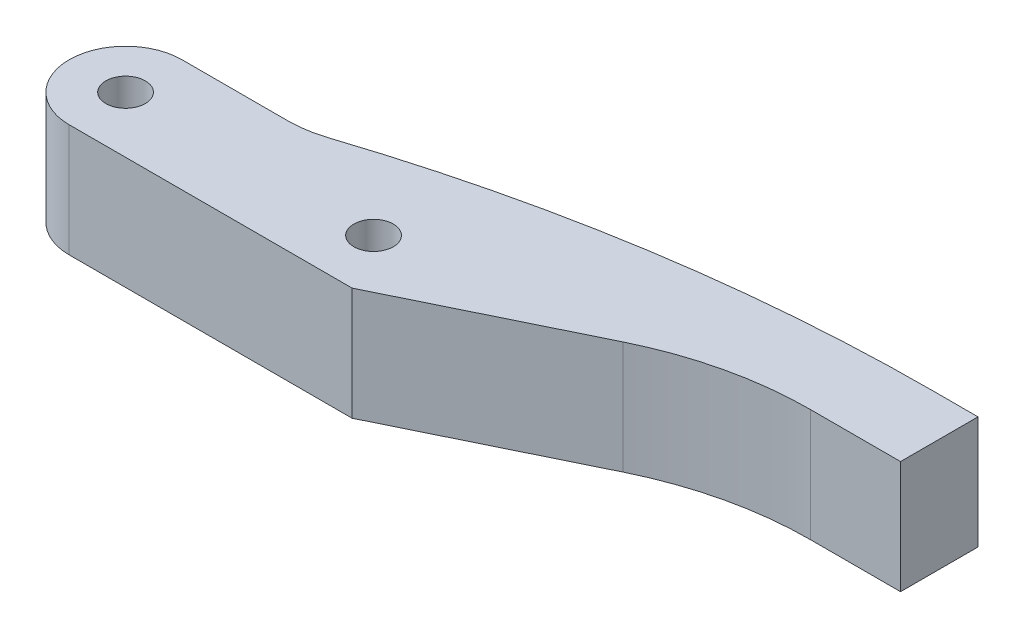
ISO-10303-21;
HEADER;
FILE_DESCRIPTION(('STEP AP214'),'2;1');
FILE_NAME('part.step','',(''),(''),'','','');
FILE_SCHEMA(('AUTOMOTIVE_DESIGN { 1 0 10303 214 1 1 1 1 }'));
ENDSEC;
DATA;
#1=APPLICATION_CONTEXT('core data for automotive mechanical design processes');
#2=APPLICATION_PROTOCOL_DEFINITION('international standard','automotive_design',2000,#1);
#3=PRODUCT_CONTEXT('',#1,'mechanical');
#4=PRODUCT('Part','Part','',(#3));
#5=PRODUCT_RELATED_PRODUCT_CATEGORY('part','',(#4));
#6=PRODUCT_DEFINITION_FORMATION('','',#4);
#7=PRODUCT_DEFINITION_CONTEXT('part definition',#1,'design');
#8=PRODUCT_DEFINITION('design','',#6,#7);
#9=PRODUCT_DEFINITION_SHAPE('','',#8);
#10=(LENGTH_UNIT() NAMED_UNIT(*) SI_UNIT(.MILLI.,.METRE.));
#11=(NAMED_UNIT(*) PLANE_ANGLE_UNIT() SI_UNIT($,.RADIAN.));
#12=(NAMED_UNIT(*) SI_UNIT($,.STERADIAN.) SOLID_ANGLE_UNIT());
#13=UNCERTAINTY_MEASURE_WITH_UNIT(LENGTH_MEASURE(1.E-05),#10,'distance_accuracy_value','');
#14=(GEOMETRIC_REPRESENTATION_CONTEXT(3) GLOBAL_UNCERTAINTY_ASSIGNED_CONTEXT((#13)) GLOBAL_UNIT_ASSIGNED_CONTEXT((#10,
#11,#12)) REPRESENTATION_CONTEXT('',''));
#15=CARTESIAN_POINT('',(0.,0.,0.));
#16=DIRECTION('',(0.,0.,1.));
#17=DIRECTION('',(1.,0.,0.));
#18=AXIS2_PLACEMENT_3D('',#15,#16,#17);
#19=CARTESIAN_POINT('',(0.,10.,0.));
#20=DIRECTION('',(0.,-1.,0.));
#21=DIRECTION('',(0.,0.,-1.));
#22=AXIS2_PLACEMENT_3D('',#19,#20,#21);
#23=CYLINDRICAL_SURFACE('',#22,5.);
#24=CARTESIAN_POINT('',(0.,0.,0.));
#25=DIRECTION('',(0.,1.,0.));
#26=DIRECTION('',(0.,0.,1.));
#27=AXIS2_PLACEMENT_3D('',#24,#25,#26);
#28=CIRCLE('',#27,5.);
#29=CARTESIAN_POINT('',(0.,0.,-5.));
#30=VERTEX_POINT('',#29);
#31=CARTESIAN_POINT('',(0.,0.,5.));
#32=VERTEX_POINT('',#31);
#33=EDGE_CURVE('E130',#30,#32,#28,.T.);
#34=ORIENTED_EDGE('',*,*,#33,.T.);
#35=DIRECTION('',(0.,-1.,0.));
#36=VECTOR('',#35,1.);
#37=CARTESIAN_POINT('',(0.,10.,5.));
#38=LINE('',#37,#36);
#39=CARTESIAN_POINT('',(0.,10.,5.));
#40=VERTEX_POINT('',#39);
#41=EDGE_CURVE('E124',#40,#32,#38,.T.);
#42=ORIENTED_EDGE('',*,*,#41,.F.);
#43=CARTESIAN_POINT('',(0.,10.,0.));
#44=DIRECTION('',(0.,1.,0.));
#45=DIRECTION('',(0.,0.,1.));
#46=AXIS2_PLACEMENT_3D('',#43,#44,#45);
#47=CIRCLE('',#46,5.);
#48=CARTESIAN_POINT('',(0.,10.,-5.));
#49=VERTEX_POINT('',#48);
#50=EDGE_CURVE('E189',#49,#40,#47,.T.);
#51=ORIENTED_EDGE('',*,*,#50,.F.);
#52=DIRECTION('',(0.,-1.,0.));
#53=VECTOR('',#52,1.);
#54=CARTESIAN_POINT('',(0.,10.,-5.));
#55=LINE('',#54,#53);
#56=EDGE_CURVE('E200',#49,#30,#55,.T.);
#57=ORIENTED_EDGE('',*,*,#56,.T.);
#58=EDGE_LOOP('',(#34,#42,#51,#57));
#59=FACE_BOUND('',#58,.T.);
#60=ADVANCED_FACE('F41',(#59),#23,.T.);
#61=CARTESIAN_POINT('',(0.,10.,5.));
#62=DIRECTION('',(0.,0.,-1.));
#63=DIRECTION('',(-1.,0.,0.));
#64=AXIS2_PLACEMENT_3D('',#61,#62,#63);
#65=PLANE('',#64);
#66=DIRECTION('',(1.,0.,0.));
#67=VECTOR('',#66,1.);
#68=CARTESIAN_POINT('',(0.,0.,5.));
#69=LINE('',#68,#67);
#70=CARTESIAN_POINT('',(25.0919928003041,0.,5.));
#71=VERTEX_POINT('',#70);
#72=EDGE_CURVE('E118',#32,#71,#69,.T.);
#73=ORIENTED_EDGE('',*,*,#72,.T.);
#74=DIRECTION('',(0.,1.,0.));
#75=VECTOR('',#74,1.);
#76=CARTESIAN_POINT('',(25.0919928003041,0.,5.));
#77=LINE('',#76,#75);
#78=CARTESIAN_POINT('',(25.0919928003041,10.,5.));
#79=VERTEX_POINT('',#78);
#80=EDGE_CURVE('E121',#71,#79,#77,.T.);
#81=ORIENTED_EDGE('',*,*,#80,.T.);
#82=DIRECTION('',(1.,0.,0.));
#83=VECTOR('',#82,1.);
#84=CARTESIAN_POINT('',(0.,10.,5.));
#85=LINE('',#84,#83);
#86=EDGE_CURVE('E193',#40,#79,#85,.T.);
#87=ORIENTED_EDGE('',*,*,#86,.F.);
#88=ORIENTED_EDGE('',*,*,#41,.T.);
#89=EDGE_LOOP('',(#73,#81,#87,#88));
#90=FACE_BOUND('',#89,.T.);
#91=ADVANCED_FACE('F120',(#90),#65,.F.);
#92=CARTESIAN_POINT('',(0.,10.,-5.));
#93=DIRECTION('',(0.,0.,-1.));
#94=DIRECTION('',(-1.,0.,0.));
#95=AXIS2_PLACEMENT_3D('',#92,#93,#94);
#96=PLANE('',#95);
#97=DIRECTION('',(1.,0.,0.));
#98=VECTOR('',#97,1.);
#99=CARTESIAN_POINT('',(0.,10.,-5.));
#100=LINE('',#99,#98);
#101=CARTESIAN_POINT('',(9.37933563339453,10.,-5.));
#102=VERTEX_POINT('',#101);
#103=EDGE_CURVE('E195',#49,#102,#100,.T.);
#104=ORIENTED_EDGE('',*,*,#103,.T.);
#105=DIRECTION('',(0.,-1.,0.));
#106=VECTOR('',#105,1.);
#107=CARTESIAN_POINT('',(9.37933563339453,0.,-5.));
#108=LINE('',#107,#106);
#109=CARTESIAN_POINT('',(9.37933563339453,0.,-5.));
#110=VERTEX_POINT('',#109);
#111=EDGE_CURVE('E62',#102,#110,#108,.T.);
#112=ORIENTED_EDGE('',*,*,#111,.T.);
#113=DIRECTION('',(1.,0.,0.));
#114=VECTOR('',#113,1.);
#115=CARTESIAN_POINT('',(0.,0.,-5.));
#116=LINE('',#115,#114);
#117=EDGE_CURVE('E129',#30,#110,#116,.T.);
#118=ORIENTED_EDGE('',*,*,#117,.F.);
#119=ORIENTED_EDGE('',*,*,#56,.F.);
#120=EDGE_LOOP('',(#104,#112,#118,#119));
#121=FACE_BOUND('',#120,.T.);
#122=ADVANCED_FACE('F241',(#121),#96,.T.);
#123=CARTESIAN_POINT('',(0.,10.,0.));
#124=DIRECTION('',(0.,-1.,0.));
#125=DIRECTION('',(0.,0.,-1.));
#126=AXIS2_PLACEMENT_3D('',#123,#124,#125);
#127=CYLINDRICAL_SURFACE('',#126,1.75);
#128=CARTESIAN_POINT('',(0.,10.,0.));
#129=DIRECTION('',(0.,1.,0.));
#130=DIRECTION('',(0.,0.,1.));
#131=AXIS2_PLACEMENT_3D('',#128,#129,#130);
#132=CIRCLE('',#131,1.75);
#133=CARTESIAN_POINT('',(0.,10.,1.75));
#134=VERTEX_POINT('',#133);
#135=EDGE_CURVE('E186',#134,#134,#132,.T.);
#136=ORIENTED_EDGE('',*,*,#135,.T.);
#137=EDGE_LOOP('',(#136));
#138=FACE_BOUND('',#137,.T.);
#139=CARTESIAN_POINT('',(0.,0.,0.));
#140=DIRECTION('',(0.,1.,0.));
#141=DIRECTION('',(0.,0.,1.));
#142=AXIS2_PLACEMENT_3D('',#139,#140,#141);
#143=CIRCLE('',#142,1.75);
#144=CARTESIAN_POINT('',(0.,0.,1.75));
#145=VERTEX_POINT('',#144);
#146=EDGE_CURVE('E178',#145,#145,#143,.T.);
#147=ORIENTED_EDGE('',*,*,#146,.F.);
#148=EDGE_LOOP('',(#147));
#149=FACE_BOUND('',#148,.T.);
#150=ADVANCED_FACE('F244',(#138,#149),#127,.F.);
#151=CARTESIAN_POINT('',(22.,10.,0.));
#152=DIRECTION('',(0.,-1.,0.));
#153=DIRECTION('',(0.,0.,-1.));
#154=AXIS2_PLACEMENT_3D('',#151,#152,#153);
#155=CYLINDRICAL_SURFACE('',#154,1.75);
#156=CARTESIAN_POINT('',(22.,10.,0.));
#157=DIRECTION('',(0.,1.,0.));
#158=DIRECTION('',(0.,0.,1.));
#159=AXIS2_PLACEMENT_3D('',#156,#157,#158);
#160=CIRCLE('',#159,1.75);
#161=CARTESIAN_POINT('',(22.,10.,1.75));
#162=VERTEX_POINT('',#161);
#163=EDGE_CURVE('E197',#162,#162,#160,.T.);
#164=ORIENTED_EDGE('',*,*,#163,.T.);
#165=EDGE_LOOP('',(#164));
#166=FACE_BOUND('',#165,.T.);
#167=CARTESIAN_POINT('',(22.,0.,0.));
#168=DIRECTION('',(0.,1.,0.));
#169=DIRECTION('',(0.,0.,1.));
#170=AXIS2_PLACEMENT_3D('',#167,#168,#169);
#171=CIRCLE('',#170,1.75);
#172=CARTESIAN_POINT('',(22.,0.,1.75));
#173=VERTEX_POINT('',#172);
#174=EDGE_CURVE('E190',#173,#173,#171,.T.);
#175=ORIENTED_EDGE('',*,*,#174,.F.);
#176=EDGE_LOOP('',(#175));
#177=FACE_BOUND('',#176,.T.);
#178=ADVANCED_FACE('F245',(#166,#177),#155,.F.);
#179=CARTESIAN_POINT('',(0.,10.,0.));
#180=DIRECTION('',(0.,1.,0.));
#181=DIRECTION('',(0.,0.,1.));
#182=AXIS2_PLACEMENT_3D('',#179,#180,#181);
#183=PLANE('',#182);
#184=ORIENTED_EDGE('',*,*,#135,.F.);
#185=EDGE_LOOP('',(#184));
#186=FACE_BOUND('',#185,.T.);
#187=ORIENTED_EDGE('',*,*,#50,.T.);
#188=ORIENTED_EDGE('',*,*,#86,.T.);
#189=DIRECTION('',(0.898794046299167,0.,-0.438371146789078));
#190=VECTOR('',#189,1.);
#191=CARTESIAN_POINT('',(25.0919928003041,10.,5.));
#192=LINE('',#191,#190);
#193=CARTESIAN_POINT('',(41.2597045065654,10.,-2.88551988168141));
#194=VERTEX_POINT('',#193);
#195=EDGE_CURVE('E137',#79,#194,#192,.T.);
#196=ORIENTED_EDGE('',*,*,#195,.T.);
#197=CARTESIAN_POINT('',(54.75,10.,24.7736847925473));
#198=DIRECTION('',(0.,-1.,0.));
#199=DIRECTION('',(0.,0.,1.));
#200=AXIS2_PLACEMENT_3D('',#197,#198,#199);
#201=CIRCLE('',#200,30.7736847925473);
#202=CARTESIAN_POINT('',(54.75,10.,-6.));
#203=VERTEX_POINT('',#202);
#204=EDGE_CURVE('E165',#194,#203,#201,.T.);
#205=ORIENTED_EDGE('',*,*,#204,.T.);
#206=DIRECTION('',(1.,0.,0.));
#207=VECTOR('',#206,1.);
#208=CARTESIAN_POINT('',(62.75,10.,-6.));
#209=LINE('',#208,#207);
#210=CARTESIAN_POINT('',(62.75,10.,-6.));
#211=VERTEX_POINT('',#210);
#212=EDGE_CURVE('E168',#203,#211,#209,.T.);
#213=ORIENTED_EDGE('',*,*,#212,.T.);
#214=DIRECTION('',(0.,0.,-1.));
#215=VECTOR('',#214,1.);
#216=CARTESIAN_POINT('',(62.75,10.,-6.));
#217=LINE('',#216,#215);
#218=CARTESIAN_POINT('',(62.75,10.,-12.87));
#219=VERTEX_POINT('',#218);
#220=EDGE_CURVE('E171',#211,#219,#217,.T.);
#221=ORIENTED_EDGE('',*,*,#220,.T.);
#222=DIRECTION('',(-1.,0.,0.));
#223=VECTOR('',#222,1.);
#224=CARTESIAN_POINT('',(62.75,10.,-12.87));
#225=LINE('',#224,#223);
#226=CARTESIAN_POINT('',(58.75,10.,-12.87));
#227=VERTEX_POINT('',#226);
#228=EDGE_CURVE('E151',#219,#227,#225,.T.);
#229=ORIENTED_EDGE('',*,*,#228,.T.);
#230=CARTESIAN_POINT('',(58.75,10.,135.922846251588));
#231=DIRECTION('',(0.,1.,0.));
#232=DIRECTION('',(0.,0.,1.));
#233=AXIS2_PLACEMENT_3D('',#230,#231,#232);
#234=CIRCLE('',#233,148.792846251588);
#235=CARTESIAN_POINT('',(12.4884595978572,10.,-5.49561426637132));
#236=VERTEX_POINT('',#235);
#237=EDGE_CURVE('E147',#227,#236,#234,.T.);
#238=ORIENTED_EDGE('',*,*,#237,.T.);
#239=CARTESIAN_POINT('',(9.37933563339453,10.,-15.));
#240=DIRECTION('',(0.,1.,0.));
#241=DIRECTION('',(0.,0.,1.));
#242=AXIS2_PLACEMENT_3D('',#239,#240,#241);
#243=CIRCLE('',#242,10.);
#244=EDGE_CURVE('E49',#236,#102,#243,.F.);
#245=ORIENTED_EDGE('',*,*,#244,.T.);
#246=ORIENTED_EDGE('',*,*,#103,.F.);
#247=EDGE_LOOP('',(#187,#188,#196,#205,#213,#221,#229,#238,#245,#246));
#248=FACE_BOUND('',#247,.T.);
#249=ORIENTED_EDGE('',*,*,#163,.F.);
#250=EDGE_LOOP('',(#249));
#251=FACE_BOUND('',#250,.T.);
#252=ADVANCED_FACE('F219',(#186,#248,#251),#183,.T.);
#253=CARTESIAN_POINT('',(0.,0.,0.));
#254=DIRECTION('',(0.,1.,0.));
#255=DIRECTION('',(0.,0.,1.));
#256=AXIS2_PLACEMENT_3D('',#253,#254,#255);
#257=PLANE('',#256);
#258=ORIENTED_EDGE('',*,*,#146,.T.);
#259=EDGE_LOOP('',(#258));
#260=FACE_BOUND('',#259,.T.);
#261=ORIENTED_EDGE('',*,*,#33,.F.);
#262=ORIENTED_EDGE('',*,*,#117,.T.);
#263=CARTESIAN_POINT('',(9.37933563339453,0.,-15.));
#264=DIRECTION('',(0.,1.,0.));
#265=DIRECTION('',(0.,0.,1.));
#266=AXIS2_PLACEMENT_3D('',#263,#264,#265);
#267=CIRCLE('',#266,10.);
#268=CARTESIAN_POINT('',(12.4884595978572,0.,-5.49561426637132));
#269=VERTEX_POINT('',#268);
#270=EDGE_CURVE('E11',#110,#269,#267,.T.);
#271=ORIENTED_EDGE('',*,*,#270,.T.);
#272=CARTESIAN_POINT('',(58.75,0.,135.922846251588));
#273=DIRECTION('',(0.,1.,0.));
#274=DIRECTION('',(0.,0.,1.));
#275=AXIS2_PLACEMENT_3D('',#272,#273,#274);
#276=CIRCLE('',#275,148.792846251588);
#277=CARTESIAN_POINT('',(58.75,0.,-12.87));
#278=VERTEX_POINT('',#277);
#279=EDGE_CURVE('E139',#278,#269,#276,.T.);
#280=ORIENTED_EDGE('',*,*,#279,.F.);
#281=DIRECTION('',(-1.,0.,0.));
#282=VECTOR('',#281,1.);
#283=CARTESIAN_POINT('',(62.75,0.,-12.87));
#284=LINE('',#283,#282);
#285=CARTESIAN_POINT('',(62.75,0.,-12.87));
#286=VERTEX_POINT('',#285);
#287=EDGE_CURVE('E159',#286,#278,#284,.T.);
#288=ORIENTED_EDGE('',*,*,#287,.F.);
#289=DIRECTION('',(0.,0.,-1.));
#290=VECTOR('',#289,1.);
#291=CARTESIAN_POINT('',(62.75,0.,-6.));
#292=LINE('',#291,#290);
#293=CARTESIAN_POINT('',(62.75,0.,-6.));
#294=VERTEX_POINT('',#293);
#295=EDGE_CURVE('E156',#294,#286,#292,.T.);
#296=ORIENTED_EDGE('',*,*,#295,.F.);
#297=DIRECTION('',(1.,0.,0.));
#298=VECTOR('',#297,1.);
#299=CARTESIAN_POINT('',(62.75,0.,-6.));
#300=LINE('',#299,#298);
#301=CARTESIAN_POINT('',(54.75,0.,-6.));
#302=VERTEX_POINT('',#301);
#303=EDGE_CURVE('E149',#302,#294,#300,.T.);
#304=ORIENTED_EDGE('',*,*,#303,.F.);
#305=CARTESIAN_POINT('',(54.75,0.,24.7736847925473));
#306=DIRECTION('',(0.,-1.,0.));
#307=DIRECTION('',(0.,0.,1.));
#308=AXIS2_PLACEMENT_3D('',#305,#306,#307);
#309=CIRCLE('',#308,30.7736847925473);
#310=CARTESIAN_POINT('',(41.2597045065654,0.,-2.88551988168141));
#311=VERTEX_POINT('',#310);
#312=EDGE_CURVE('E146',#311,#302,#309,.T.);
#313=ORIENTED_EDGE('',*,*,#312,.F.);
#314=DIRECTION('',(0.898794046299167,0.,-0.438371146789078));
#315=VECTOR('',#314,1.);
#316=CARTESIAN_POINT('',(25.0919928003041,0.,5.));
#317=LINE('',#316,#315);
#318=EDGE_CURVE('E135',#71,#311,#317,.T.);
#319=ORIENTED_EDGE('',*,*,#318,.F.);
#320=ORIENTED_EDGE('',*,*,#72,.F.);
#321=EDGE_LOOP('',(#261,#262,#271,#280,#288,#296,#304,#313,#319,#320));
#322=FACE_BOUND('',#321,.T.);
#323=ORIENTED_EDGE('',*,*,#174,.T.);
#324=EDGE_LOOP('',(#323));
#325=FACE_BOUND('',#324,.T.);
#326=ADVANCED_FACE('F142',(#260,#322,#325),#257,.F.);
#327=CARTESIAN_POINT('',(58.75,0.,135.922846251588));
#328=DIRECTION('',(0.,1.,0.));
#329=DIRECTION('',(0.,0.,1.));
#330=AXIS2_PLACEMENT_3D('',#327,#328,#329);
#331=CYLINDRICAL_SURFACE('',#330,148.792846251588);
#332=ORIENTED_EDGE('',*,*,#279,.T.);
#333=DIRECTION('',(0.,1.,0.));
#334=VECTOR('',#333,1.);
#335=CARTESIAN_POINT('',(12.4884595978572,0.,-5.49561426637132));
#336=LINE('',#335,#334);
#337=EDGE_CURVE('E209',#269,#236,#336,.T.);
#338=ORIENTED_EDGE('',*,*,#337,.T.);
#339=ORIENTED_EDGE('',*,*,#237,.F.);
#340=DIRECTION('',(0.,1.,0.));
#341=VECTOR('',#340,1.);
#342=CARTESIAN_POINT('',(58.75,0.,-12.87));
#343=LINE('',#342,#341);
#344=EDGE_CURVE('E176',#278,#227,#343,.T.);
#345=ORIENTED_EDGE('',*,*,#344,.F.);
#346=EDGE_LOOP('',(#332,#338,#339,#345));
#347=FACE_BOUND('',#346,.T.);
#348=ADVANCED_FACE('F215',(#347),#331,.T.);
#349=CARTESIAN_POINT('',(62.75,0.,-12.87));
#350=DIRECTION('',(0.,0.,-1.));
#351=DIRECTION('',(-1.,0.,0.));
#352=AXIS2_PLACEMENT_3D('',#349,#350,#351);
#353=PLANE('',#352);
#354=ORIENTED_EDGE('',*,*,#228,.F.);
#355=DIRECTION('',(0.,1.,0.));
#356=VECTOR('',#355,1.);
#357=CARTESIAN_POINT('',(62.75,0.,-12.87));
#358=LINE('',#357,#356);
#359=EDGE_CURVE('E179',#286,#219,#358,.T.);
#360=ORIENTED_EDGE('',*,*,#359,.F.);
#361=ORIENTED_EDGE('',*,*,#287,.T.);
#362=ORIENTED_EDGE('',*,*,#344,.T.);
#363=EDGE_LOOP('',(#354,#360,#361,#362));
#364=FACE_BOUND('',#363,.T.);
#365=ADVANCED_FACE('F224',(#364),#353,.T.);
#366=CARTESIAN_POINT('',(62.75,0.,-6.));
#367=DIRECTION('',(1.,0.,0.));
#368=DIRECTION('',(0.,0.,-1.));
#369=AXIS2_PLACEMENT_3D('',#366,#367,#368);
#370=PLANE('',#369);
#371=ORIENTED_EDGE('',*,*,#220,.F.);
#372=DIRECTION('',(0.,1.,0.));
#373=VECTOR('',#372,1.);
#374=CARTESIAN_POINT('',(62.75,0.,-6.));
#375=LINE('',#374,#373);
#376=EDGE_CURVE('E181',#294,#211,#375,.T.);
#377=ORIENTED_EDGE('',*,*,#376,.F.);
#378=ORIENTED_EDGE('',*,*,#295,.T.);
#379=ORIENTED_EDGE('',*,*,#359,.T.);
#380=EDGE_LOOP('',(#371,#377,#378,#379));
#381=FACE_BOUND('',#380,.T.);
#382=ADVANCED_FACE('F272',(#381),#370,.T.);
#383=CARTESIAN_POINT('',(62.75,0.,-6.));
#384=DIRECTION('',(0.,0.,1.));
#385=DIRECTION('',(1.,0.,0.));
#386=AXIS2_PLACEMENT_3D('',#383,#384,#385);
#387=PLANE('',#386);
#388=ORIENTED_EDGE('',*,*,#212,.F.);
#389=DIRECTION('',(0.,1.,0.));
#390=VECTOR('',#389,1.);
#391=CARTESIAN_POINT('',(54.75,0.,-6.));
#392=LINE('',#391,#390);
#393=EDGE_CURVE('E183',#302,#203,#392,.T.);
#394=ORIENTED_EDGE('',*,*,#393,.F.);
#395=ORIENTED_EDGE('',*,*,#303,.T.);
#396=ORIENTED_EDGE('',*,*,#376,.T.);
#397=EDGE_LOOP('',(#388,#394,#395,#396));
#398=FACE_BOUND('',#397,.T.);
#399=ADVANCED_FACE('F268',(#398),#387,.T.);
#400=CARTESIAN_POINT('',(54.75,0.,24.7736847925473));
#401=DIRECTION('',(0.,1.,0.));
#402=DIRECTION('',(0.,0.,1.));
#403=AXIS2_PLACEMENT_3D('',#400,#401,#402);
#404=CYLINDRICAL_SURFACE('',#403,30.7736847925473);
#405=ORIENTED_EDGE('',*,*,#204,.F.);
#406=DIRECTION('',(0.,1.,0.));
#407=VECTOR('',#406,1.);
#408=CARTESIAN_POINT('',(41.2597045065654,0.,-2.88551988168141));
#409=LINE('',#408,#407);
#410=EDGE_CURVE('E138',#311,#194,#409,.T.);
#411=ORIENTED_EDGE('',*,*,#410,.F.);
#412=ORIENTED_EDGE('',*,*,#312,.T.);
#413=ORIENTED_EDGE('',*,*,#393,.T.);
#414=EDGE_LOOP('',(#405,#411,#412,#413));
#415=FACE_BOUND('',#414,.T.);
#416=ADVANCED_FACE('F232',(#415),#404,.F.);
#417=CARTESIAN_POINT('',(25.0919928003041,0.,5.));
#418=DIRECTION('',(0.438371146789078,0.,0.898794046299167));
#419=DIRECTION('',(0.898794046299167,0.,-0.438371146789078));
#420=AXIS2_PLACEMENT_3D('',#417,#418,#419);
#421=PLANE('',#420);
#422=ORIENTED_EDGE('',*,*,#195,.F.);
#423=ORIENTED_EDGE('',*,*,#80,.F.);
#424=ORIENTED_EDGE('',*,*,#318,.T.);
#425=ORIENTED_EDGE('',*,*,#410,.T.);
#426=EDGE_LOOP('',(#422,#423,#424,#425));
#427=FACE_BOUND('',#426,.T.);
#428=ADVANCED_FACE('F134',(#427),#421,.T.);
#429=CARTESIAN_POINT('',(9.37933563339453,0.,-15.));
#430=DIRECTION('',(0.,1.,0.));
#431=DIRECTION('',(0.,0.,1.));
#432=AXIS2_PLACEMENT_3D('',#429,#430,#431);
#433=CYLINDRICAL_SURFACE('',#432,10.);
#434=ORIENTED_EDGE('',*,*,#270,.F.);
#435=ORIENTED_EDGE('',*,*,#111,.F.);
#436=ORIENTED_EDGE('',*,*,#244,.F.);
#437=ORIENTED_EDGE('',*,*,#337,.F.);
#438=EDGE_LOOP('',(#434,#435,#436,#437));
#439=FACE_BOUND('',#438,.T.);
#440=ADVANCED_FACE('F43',(#439),#433,.F.);
#441=CLOSED_SHELL('',(#60,#91,#122,#150,#178,#252,#326,#348,#365,#382,#399,#416,#428,#440));
#442=MANIFOLD_SOLID_BREP('B2',#441);
#443=ADVANCED_BREP_SHAPE_REPRESENTATION('',(#18,#442),#14);
#444=SHAPE_DEFINITION_REPRESENTATION(#9,#443);
ENDSEC;
END-ISO-10303-21;
